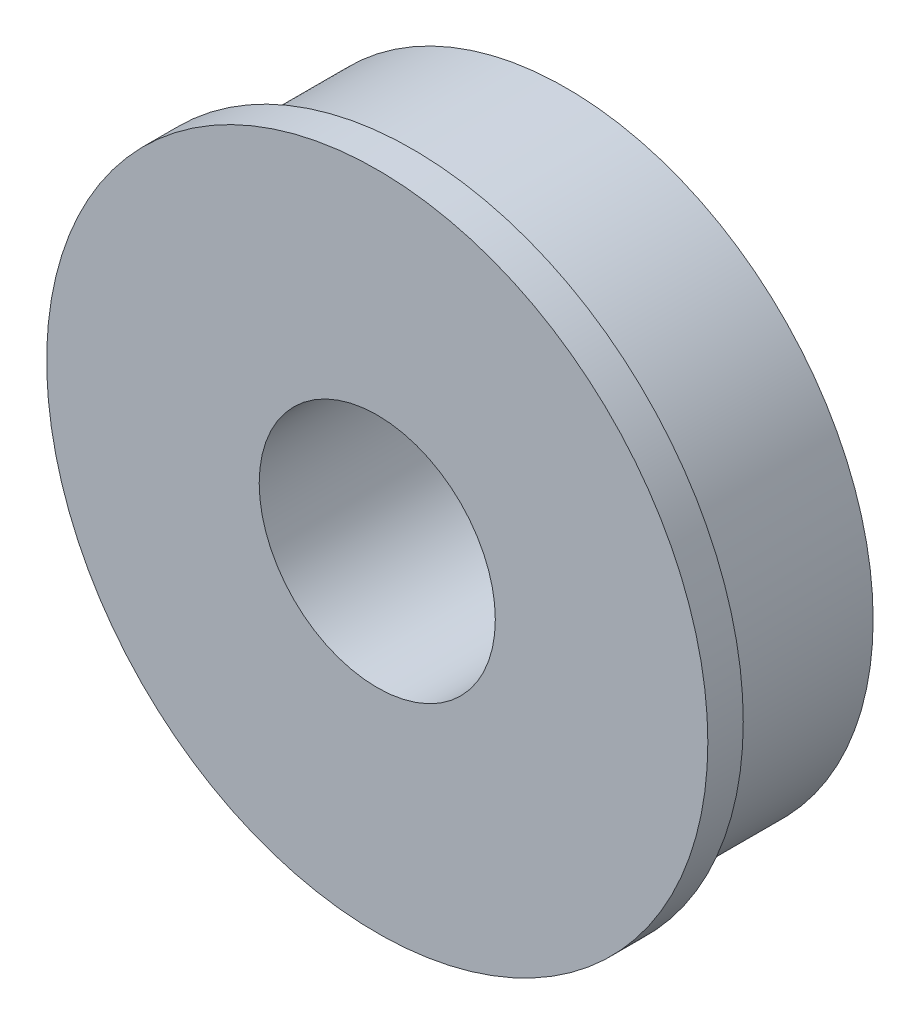
ISO-10303-21;
HEADER;
FILE_DESCRIPTION(('STEP AP214'),'2;1');
FILE_NAME('part.step','',(''),(''),'','','');
FILE_SCHEMA(('AUTOMOTIVE_DESIGN { 1 0 10303 214 1 1 1 1 }'));
ENDSEC;
DATA;
#1=APPLICATION_CONTEXT('core data for automotive mechanical design processes');
#2=APPLICATION_PROTOCOL_DEFINITION('international standard','automotive_design',2000,#1);
#3=PRODUCT_CONTEXT('',#1,'mechanical');
#4=PRODUCT('Part','Part','',(#3));
#5=PRODUCT_RELATED_PRODUCT_CATEGORY('part','',(#4));
#6=PRODUCT_DEFINITION_FORMATION('','',#4);
#7=PRODUCT_DEFINITION_CONTEXT('part definition',#1,'design');
#8=PRODUCT_DEFINITION('design','',#6,#7);
#9=PRODUCT_DEFINITION_SHAPE('','',#8);
#10=(LENGTH_UNIT() NAMED_UNIT(*) SI_UNIT(.MILLI.,.METRE.));
#11=(NAMED_UNIT(*) PLANE_ANGLE_UNIT() SI_UNIT($,.RADIAN.));
#12=(NAMED_UNIT(*) SI_UNIT($,.STERADIAN.) SOLID_ANGLE_UNIT());
#13=UNCERTAINTY_MEASURE_WITH_UNIT(LENGTH_MEASURE(1.E-05),#10,'distance_accuracy_value','');
#14=(GEOMETRIC_REPRESENTATION_CONTEXT(3) GLOBAL_UNCERTAINTY_ASSIGNED_CONTEXT((#13)) GLOBAL_UNIT_ASSIGNED_CONTEXT((#10,
#11,#12)) REPRESENTATION_CONTEXT('',''));
#15=CARTESIAN_POINT('',(0.,0.,0.));
#16=DIRECTION('',(0.,0.,1.));
#17=DIRECTION('',(1.,0.,0.));
#18=AXIS2_PLACEMENT_3D('',#15,#16,#17);
#19=CARTESIAN_POINT('',(0.,0.,8.));
#20=DIRECTION('',(0.,0.,-1.));
#21=DIRECTION('',(-1.,0.,0.));
#22=AXIS2_PLACEMENT_3D('',#19,#20,#21);
#23=CYLINDRICAL_SURFACE('',#22,13.);
#24=CARTESIAN_POINT('',(0.,0.,0.));
#25=DIRECTION('',(0.,0.,1.));
#26=DIRECTION('',(1.,0.,0.));
#27=AXIS2_PLACEMENT_3D('',#24,#25,#26);
#28=CIRCLE('',#27,13.);
#29=CARTESIAN_POINT('',(13.,0.,0.));
#30=VERTEX_POINT('',#29);
#31=EDGE_CURVE('E37',#30,#30,#28,.T.);
#32=ORIENTED_EDGE('',*,*,#31,.T.);
#33=EDGE_LOOP('',(#32));
#34=FACE_BOUND('',#33,.T.);
#35=CARTESIAN_POINT('',(0.,0.,6.5));
#36=DIRECTION('',(0.,0.,1.));
#37=DIRECTION('',(1.,0.,0.));
#38=AXIS2_PLACEMENT_3D('',#35,#36,#37);
#39=CIRCLE('',#38,13.);
#40=CARTESIAN_POINT('',(13.,0.,6.5));
#41=VERTEX_POINT('',#40);
#42=EDGE_CURVE('E10',#41,#41,#39,.T.);
#43=ORIENTED_EDGE('',*,*,#42,.F.);
#44=EDGE_LOOP('',(#43));
#45=FACE_BOUND('',#44,.T.);
#46=ADVANCED_FACE('F34',(#34,#45),#23,.T.);
#47=CARTESIAN_POINT('',(0.,0.,8.));
#48=DIRECTION('',(0.,0.,1.));
#49=DIRECTION('',(1.,0.,0.));
#50=AXIS2_PLACEMENT_3D('',#47,#48,#49);
#51=PLANE('',#50);
#52=CARTESIAN_POINT('',(0.,0.,8.));
#53=DIRECTION('',(0.,0.,1.));
#54=DIRECTION('',(1.,0.,0.));
#55=AXIS2_PLACEMENT_3D('',#52,#53,#54);
#56=CIRCLE('',#55,5.);
#57=CARTESIAN_POINT('',(5.,0.,8.));
#58=VERTEX_POINT('',#57);
#59=EDGE_CURVE('E45',#58,#58,#56,.T.);
#60=ORIENTED_EDGE('',*,*,#59,.F.);
#61=EDGE_LOOP('',(#60));
#62=FACE_BOUND('',#61,.T.);
#63=CARTESIAN_POINT('',(0.,0.,8.));
#64=DIRECTION('',(0.,0.,1.));
#65=DIRECTION('',(1.,0.,0.));
#66=AXIS2_PLACEMENT_3D('',#63,#64,#65);
#67=CIRCLE('',#66,14.);
#68=CARTESIAN_POINT('',(14.,0.,8.));
#69=VERTEX_POINT('',#68);
#70=EDGE_CURVE('E48',#69,#69,#67,.T.);
#71=ORIENTED_EDGE('',*,*,#70,.T.);
#72=EDGE_LOOP('',(#71));
#73=FACE_BOUND('',#72,.T.);
#74=ADVANCED_FACE('F62',(#62,#73),#51,.T.);
#75=CARTESIAN_POINT('',(0.,0.,0.));
#76=DIRECTION('',(0.,0.,1.));
#77=DIRECTION('',(1.,0.,0.));
#78=AXIS2_PLACEMENT_3D('',#75,#76,#77);
#79=PLANE('',#78);
#80=ORIENTED_EDGE('',*,*,#31,.F.);
#81=EDGE_LOOP('',(#80));
#82=FACE_BOUND('',#81,.T.);
#83=CARTESIAN_POINT('',(0.,0.,0.));
#84=DIRECTION('',(0.,0.,1.));
#85=DIRECTION('',(1.,0.,0.));
#86=AXIS2_PLACEMENT_3D('',#83,#84,#85);
#87=CIRCLE('',#86,5.);
#88=CARTESIAN_POINT('',(5.,0.,0.));
#89=VERTEX_POINT('',#88);
#90=EDGE_CURVE('E51',#89,#89,#87,.T.);
#91=ORIENTED_EDGE('',*,*,#90,.T.);
#92=EDGE_LOOP('',(#91));
#93=FACE_BOUND('',#92,.T.);
#94=ADVANCED_FACE('F80',(#82,#93),#79,.F.);
#95=CARTESIAN_POINT('',(0.,0.,8.));
#96=DIRECTION('',(0.,0.,-1.));
#97=DIRECTION('',(-1.,0.,0.));
#98=AXIS2_PLACEMENT_3D('',#95,#96,#97);
#99=CYLINDRICAL_SURFACE('',#98,5.);
#100=ORIENTED_EDGE('',*,*,#59,.T.);
#101=EDGE_LOOP('',(#100));
#102=FACE_BOUND('',#101,.T.);
#103=ORIENTED_EDGE('',*,*,#90,.F.);
#104=EDGE_LOOP('',(#103));
#105=FACE_BOUND('',#104,.T.);
#106=ADVANCED_FACE('F71',(#102,#105),#99,.F.);
#107=CARTESIAN_POINT('',(0.,0.,6.5));
#108=DIRECTION('',(0.,0.,1.));
#109=DIRECTION('',(1.,0.,0.));
#110=AXIS2_PLACEMENT_3D('',#107,#108,#109);
#111=PLANE('',#110);
#112=CARTESIAN_POINT('',(0.,0.,6.5));
#113=DIRECTION('',(0.,0.,1.));
#114=DIRECTION('',(1.,0.,0.));
#115=AXIS2_PLACEMENT_3D('',#112,#113,#114);
#116=CIRCLE('',#115,14.);
#117=CARTESIAN_POINT('',(14.,0.,6.5));
#118=VERTEX_POINT('',#117);
#119=EDGE_CURVE('E53',#118,#118,#116,.T.);
#120=ORIENTED_EDGE('',*,*,#119,.F.);
#121=EDGE_LOOP('',(#120));
#122=FACE_BOUND('',#121,.T.);
#123=ORIENTED_EDGE('',*,*,#42,.T.);
#124=EDGE_LOOP('',(#123));
#125=FACE_BOUND('',#124,.T.);
#126=ADVANCED_FACE('F66',(#122,#125),#111,.F.);
#127=CARTESIAN_POINT('',(0.,0.,6.5));
#128=DIRECTION('',(0.,0.,1.));
#129=DIRECTION('',(1.,0.,0.));
#130=AXIS2_PLACEMENT_3D('',#127,#128,#129);
#131=CYLINDRICAL_SURFACE('',#130,14.);
#132=ORIENTED_EDGE('',*,*,#119,.T.);
#133=EDGE_LOOP('',(#132));
#134=FACE_BOUND('',#133,.T.);
#135=ORIENTED_EDGE('',*,*,#70,.F.);
#136=EDGE_LOOP('',(#135));
#137=FACE_BOUND('',#136,.T.);
#138=ADVANCED_FACE('F64',(#134,#137),#131,.T.);
#139=CLOSED_SHELL('',(#46,#74,#94,#106,#126,#138));
#140=MANIFOLD_SOLID_BREP('B2',#139);
#141=ADVANCED_BREP_SHAPE_REPRESENTATION('',(#18,#140),#14);
#142=SHAPE_DEFINITION_REPRESENTATION(#9,#141);
ENDSEC;
END-ISO-10303-21;
